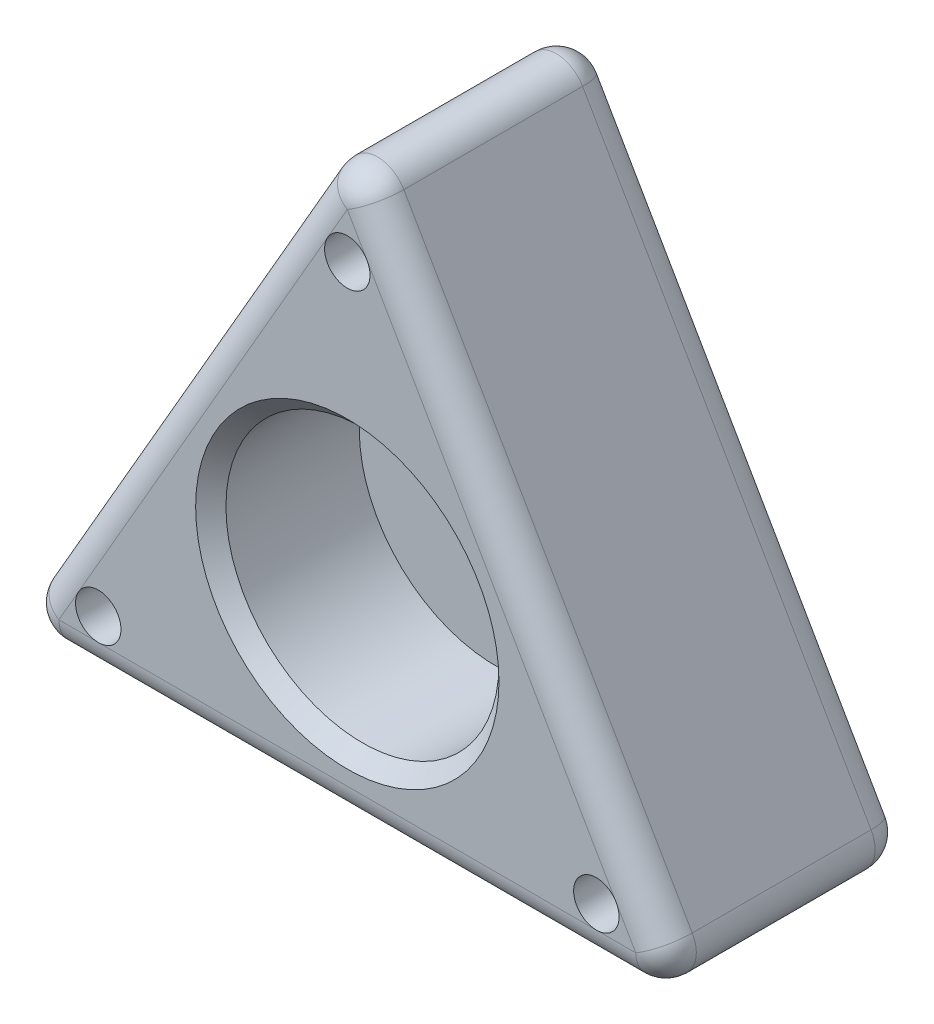
ISO-10303-21;
HEADER;
FILE_DESCRIPTION(('STEP AP214'),'2;1');
FILE_NAME('part.step','',(''),(''),'','','');
FILE_SCHEMA(('AUTOMOTIVE_DESIGN { 1 0 10303 214 1 1 1 1 }'));
ENDSEC;
DATA;
#1=APPLICATION_CONTEXT('core data for automotive mechanical design processes');
#2=APPLICATION_PROTOCOL_DEFINITION('international standard','automotive_design',2000,#1);
#3=PRODUCT_CONTEXT('',#1,'mechanical');
#4=PRODUCT('Part','Part','',(#3));
#5=PRODUCT_RELATED_PRODUCT_CATEGORY('part','',(#4));
#6=PRODUCT_DEFINITION_FORMATION('','',#4);
#7=PRODUCT_DEFINITION_CONTEXT('part definition',#1,'design');
#8=PRODUCT_DEFINITION('design','',#6,#7);
#9=PRODUCT_DEFINITION_SHAPE('','',#8);
#10=(LENGTH_UNIT() NAMED_UNIT(*) SI_UNIT(.MILLI.,.METRE.));
#11=(NAMED_UNIT(*) PLANE_ANGLE_UNIT() SI_UNIT($,.RADIAN.));
#12=(NAMED_UNIT(*) SI_UNIT($,.STERADIAN.) SOLID_ANGLE_UNIT());
#13=UNCERTAINTY_MEASURE_WITH_UNIT(LENGTH_MEASURE(1.E-05),#10,'distance_accuracy_value','');
#14=(GEOMETRIC_REPRESENTATION_CONTEXT(3) GLOBAL_UNCERTAINTY_ASSIGNED_CONTEXT((#13)) GLOBAL_UNIT_ASSIGNED_CONTEXT((#10,
#11,#12)) REPRESENTATION_CONTEXT('',''));
#15=CARTESIAN_POINT('',(0.,0.,0.));
#16=DIRECTION('',(0.,0.,1.));
#17=DIRECTION('',(1.,0.,0.));
#18=AXIS2_PLACEMENT_3D('',#15,#16,#17);
#19=CARTESIAN_POINT('',(22.4999999999999,34.9711431702998,-15.8));
#20=DIRECTION('',(0.,0.,1.));
#21=DIRECTION('',(-1.,0.,0.));
#22=AXIS2_PLACEMENT_3D('',#19,#20,#21);
#23=PLANE('',#22);
#24=DIRECTION('',(0.499999999999998,0.86602540378444,0.));
#25=VECTOR('',#24,1.);
#26=CARTESIAN_POINT('',(3.46410161513774,2.,-15.8));
#27=LINE('',#26,#25);
#28=CARTESIAN_POINT('',(4.76313972081451,4.2500000000002,-15.8));
#29=VERTEX_POINT('',#28);
#30=CARTESIAN_POINT('',(3.46410161513775,2.,-15.8));
#31=VERTEX_POINT('',#30);
#32=EDGE_CURVE('E232',#29,#31,#27,.F.);
#33=ORIENTED_EDGE('',*,*,#32,.F.);
#34=CARTESIAN_POINT('',(6.06217782649106,3.50000000000027,-15.8));
#35=DIRECTION('',(0.,0.,-1.));
#36=DIRECTION('',(-1.,0.,0.));
#37=AXIS2_PLACEMENT_3D('',#34,#35,#36);
#38=CIRCLE('',#37,1.5);
#39=CARTESIAN_POINT('',(6.06217782649106,2.,-15.8));
#40=VERTEX_POINT('',#39);
#41=EDGE_CURVE('E296',#40,#29,#38,.T.);
#42=ORIENTED_EDGE('',*,*,#41,.F.);
#43=DIRECTION('',(1.,0.,0.));
#44=VECTOR('',#43,1.);
#45=CARTESIAN_POINT('',(22.4999999999999,2.,-15.8));
#46=LINE('',#45,#44);
#47=EDGE_CURVE('E251',#31,#40,#46,.T.);
#48=ORIENTED_EDGE('',*,*,#47,.F.);
#49=EDGE_LOOP('',(#33,#42,#48));
#50=FACE_BOUND('',#49,.T.);
#51=ADVANCED_FACE('F37',(#50),#23,.F.);
#52=EDGE_CURVE('E292',#29,#40,#38,.T.);
#53=ORIENTED_EDGE('',*,*,#52,.F.);
#54=DIRECTION('',(0.499999999999998,0.86602540378444,0.));
#55=VECTOR('',#54,1.);
#56=CARTESIAN_POINT('',(3.46410161513774,2.,-15.8));
#57=LINE('',#56,#55);
#58=CARTESIAN_POINT('',(21.2009618943233,32.7211431702998,-15.8));
#59=VERTEX_POINT('',#58);
#60=EDGE_CURVE('E235',#59,#29,#57,.F.);
#61=ORIENTED_EDGE('',*,*,#60,.F.);
#62=CARTESIAN_POINT('',(22.4999999999999,31.9711431702998,-15.8));
#63=DIRECTION('',(0.,0.,1.));
#64=DIRECTION('',(1.,0.,0.));
#65=AXIS2_PLACEMENT_3D('',#62,#63,#64);
#66=CIRCLE('',#65,1.5);
#67=CARTESIAN_POINT('',(23.7990381056766,32.7211431702998,-15.8));
#68=VERTEX_POINT('',#67);
#69=EDGE_CURVE('E360',#59,#68,#66,.T.);
#70=ORIENTED_EDGE('',*,*,#69,.T.);
#71=DIRECTION('',(0.500000000000001,-0.866025403784438,0.));
#72=VECTOR('',#71,1.);
#73=CARTESIAN_POINT('',(22.4999999999999,34.9711431702998,-15.8));
#74=LINE('',#73,#72);
#75=CARTESIAN_POINT('',(40.2368602791856,4.25,-15.8));
#76=VERTEX_POINT('',#75);
#77=EDGE_CURVE('E242',#76,#68,#74,.F.);
#78=ORIENTED_EDGE('',*,*,#77,.F.);
#79=CARTESIAN_POINT('',(38.9378221735089,3.5,-15.8));
#80=DIRECTION('',(0.,0.,1.));
#81=DIRECTION('',(1.,0.,0.));
#82=AXIS2_PLACEMENT_3D('',#79,#80,#81);
#83=CIRCLE('',#82,1.5);
#84=CARTESIAN_POINT('',(38.9378221735089,2.,-15.8));
#85=VERTEX_POINT('',#84);
#86=EDGE_CURVE('E337',#76,#85,#83,.T.);
#87=ORIENTED_EDGE('',*,*,#86,.T.);
#88=DIRECTION('',(1.,0.,0.));
#89=VECTOR('',#88,1.);
#90=CARTESIAN_POINT('',(22.4999999999999,2.,-15.8));
#91=LINE('',#90,#89);
#92=EDGE_CURVE('E249',#40,#85,#91,.T.);
#93=ORIENTED_EDGE('',*,*,#92,.F.);
#94=EDGE_LOOP('',(#53,#61,#70,#78,#87,#93));
#95=FACE_BOUND('',#94,.T.);
#96=ADVANCED_FACE('F338',(#95),#23,.F.);
#97=EDGE_CURVE('E343',#85,#76,#83,.T.);
#98=ORIENTED_EDGE('',*,*,#97,.T.);
#99=DIRECTION('',(0.500000000000001,-0.866025403784438,0.));
#100=VECTOR('',#99,1.);
#101=CARTESIAN_POINT('',(22.4999999999999,34.9711431702998,-15.8));
#102=LINE('',#101,#100);
#103=CARTESIAN_POINT('',(41.5358983848622,2.,-15.8));
#104=VERTEX_POINT('',#103);
#105=EDGE_CURVE('E245',#104,#76,#102,.F.);
#106=ORIENTED_EDGE('',*,*,#105,.F.);
#107=DIRECTION('',(1.,0.,0.));
#108=VECTOR('',#107,1.);
#109=CARTESIAN_POINT('',(22.4999999999999,2.,-15.8));
#110=LINE('',#109,#108);
#111=EDGE_CURVE('E247',#85,#104,#110,.T.);
#112=ORIENTED_EDGE('',*,*,#111,.F.);
#113=EDGE_LOOP('',(#98,#106,#112));
#114=FACE_BOUND('',#113,.T.);
#115=ADVANCED_FACE('F404',(#114),#23,.F.);
#116=CARTESIAN_POINT('',(22.4999999999999,34.9711431702998,0.));
#117=DIRECTION('',(0.,0.,1.));
#118=DIRECTION('',(-1.,0.,0.));
#119=AXIS2_PLACEMENT_3D('',#116,#117,#118);
#120=PLANE('',#119);
#121=CARTESIAN_POINT('',(22.4999999999999,12.9903810567666,0.));
#122=DIRECTION('',(0.,0.,-1.));
#123=DIRECTION('',(-1.,0.,0.));
#124=AXIS2_PLACEMENT_3D('',#121,#122,#123);
#125=CIRCLE('',#124,10.01);
#126=CARTESIAN_POINT('',(12.4899999999999,12.9903810567666,0.));
#127=VERTEX_POINT('',#126);
#128=EDGE_CURVE('E182',#127,#127,#125,.F.);
#129=ORIENTED_EDGE('',*,*,#128,.F.);
#130=EDGE_LOOP('',(#129));
#131=FACE_BOUND('',#130,.T.);
#132=CARTESIAN_POINT('',(22.4999999999999,31.9711431702998,0.));
#133=DIRECTION('',(0.,0.,1.));
#134=DIRECTION('',(1.,0.,0.));
#135=AXIS2_PLACEMENT_3D('',#132,#133,#134);
#136=CIRCLE('',#135,1.5);
#137=CARTESIAN_POINT('',(21.2009618943233,32.7211431702998,0.));
#138=VERTEX_POINT('',#137);
#139=CARTESIAN_POINT('',(23.7990381056766,32.7211431702998,0.));
#140=VERTEX_POINT('',#139);
#141=EDGE_CURVE('E366',#138,#140,#136,.T.);
#142=ORIENTED_EDGE('',*,*,#141,.F.);
#143=DIRECTION('',(0.499999999999998,0.86602540378444,0.));
#144=VECTOR('',#143,1.);
#145=CARTESIAN_POINT('',(22.4999999999999,34.9711431702998,0.));
#146=LINE('',#145,#144);
#147=CARTESIAN_POINT('',(4.7631397208145,4.25000000000021,0.));
#148=VERTEX_POINT('',#147);
#149=EDGE_CURVE('E194',#148,#138,#146,.T.);
#150=ORIENTED_EDGE('',*,*,#149,.F.);
#151=CARTESIAN_POINT('',(6.06217782649106,3.50000000000027,0.));
#152=DIRECTION('',(0.,0.,-1.));
#153=DIRECTION('',(-1.,0.,0.));
#154=AXIS2_PLACEMENT_3D('',#151,#152,#153);
#155=CIRCLE('',#154,1.5);
#156=CARTESIAN_POINT('',(6.06217782649106,2.,0.));
#157=VERTEX_POINT('',#156);
#158=EDGE_CURVE('E307',#148,#157,#155,.T.);
#159=ORIENTED_EDGE('',*,*,#158,.T.);
#160=DIRECTION('',(1.,0.,0.));
#161=VECTOR('',#160,1.);
#162=CARTESIAN_POINT('',(3.46410161513775,2.,0.));
#163=LINE('',#162,#161);
#164=CARTESIAN_POINT('',(38.9378221735089,2.,0.));
#165=VERTEX_POINT('',#164);
#166=EDGE_CURVE('E204',#165,#157,#163,.F.);
#167=ORIENTED_EDGE('',*,*,#166,.F.);
#168=CARTESIAN_POINT('',(38.9378221735089,3.5,0.));
#169=DIRECTION('',(0.,0.,1.));
#170=DIRECTION('',(1.,0.,0.));
#171=AXIS2_PLACEMENT_3D('',#168,#169,#170);
#172=CIRCLE('',#171,1.5);
#173=CARTESIAN_POINT('',(40.2368602791856,4.25,0.));
#174=VERTEX_POINT('',#173);
#175=EDGE_CURVE('E346',#174,#165,#172,.T.);
#176=ORIENTED_EDGE('',*,*,#175,.F.);
#177=DIRECTION('',(0.500000000000001,-0.866025403784438,0.));
#178=VECTOR('',#177,1.);
#179=CARTESIAN_POINT('',(22.4999999999999,34.9711431702998,0.));
#180=LINE('',#179,#178);
#181=EDGE_CURVE('E212',#140,#174,#180,.T.);
#182=ORIENTED_EDGE('',*,*,#181,.F.);
#183=EDGE_LOOP('',(#142,#150,#159,#167,#176,#182));
#184=FACE_BOUND('',#183,.T.);
#185=ADVANCED_FACE('F382',(#131,#184),#120,.T.);
#186=EDGE_CURVE('E352',#165,#174,#172,.T.);
#187=ORIENTED_EDGE('',*,*,#186,.F.);
#188=DIRECTION('',(1.,0.,0.));
#189=VECTOR('',#188,1.);
#190=CARTESIAN_POINT('',(3.46410161513775,2.,0.));
#191=LINE('',#190,#189);
#192=CARTESIAN_POINT('',(41.5358983848622,2.,0.));
#193=VERTEX_POINT('',#192);
#194=EDGE_CURVE('E207',#193,#165,#191,.F.);
#195=ORIENTED_EDGE('',*,*,#194,.F.);
#196=DIRECTION('',(0.500000000000001,-0.866025403784438,0.));
#197=VECTOR('',#196,1.);
#198=CARTESIAN_POINT('',(22.4999999999999,34.9711431702998,0.));
#199=LINE('',#198,#197);
#200=EDGE_CURVE('E209',#174,#193,#199,.T.);
#201=ORIENTED_EDGE('',*,*,#200,.F.);
#202=EDGE_LOOP('',(#187,#195,#201));
#203=FACE_BOUND('',#202,.T.);
#204=ADVANCED_FACE('F413',(#203),#120,.T.);
#205=EDGE_CURVE('E342',#157,#148,#155,.T.);
#206=ORIENTED_EDGE('',*,*,#205,.T.);
#207=DIRECTION('',(0.499999999999998,0.86602540378444,0.));
#208=VECTOR('',#207,1.);
#209=CARTESIAN_POINT('',(22.4999999999999,34.9711431702998,0.));
#210=LINE('',#209,#208);
#211=CARTESIAN_POINT('',(3.46410161513773,2.00000000000001,0.));
#212=VERTEX_POINT('',#211);
#213=EDGE_CURVE('E197',#212,#148,#210,.T.);
#214=ORIENTED_EDGE('',*,*,#213,.F.);
#215=DIRECTION('',(1.,0.,0.));
#216=VECTOR('',#215,1.);
#217=CARTESIAN_POINT('',(3.46410161513775,2.,0.));
#218=LINE('',#217,#216);
#219=EDGE_CURVE('E201',#157,#212,#218,.F.);
#220=ORIENTED_EDGE('',*,*,#219,.F.);
#221=EDGE_LOOP('',(#206,#214,#220));
#222=FACE_BOUND('',#221,.T.);
#223=ADVANCED_FACE('F408',(#222),#120,.T.);
#224=EDGE_CURVE('E357',#68,#59,#66,.T.);
#225=ORIENTED_EDGE('',*,*,#224,.T.);
#226=DIRECTION('',(0.499999999999998,0.86602540378444,0.));
#227=VECTOR('',#226,1.);
#228=CARTESIAN_POINT('',(3.46410161513774,2.,-15.8));
#229=LINE('',#228,#227);
#230=CARTESIAN_POINT('',(22.4999999999999,34.9711431702998,-15.8));
#231=VERTEX_POINT('',#230);
#232=EDGE_CURVE('E237',#231,#59,#229,.F.);
#233=ORIENTED_EDGE('',*,*,#232,.F.);
#234=DIRECTION('',(0.500000000000001,-0.866025403784438,0.));
#235=VECTOR('',#234,1.);
#236=CARTESIAN_POINT('',(22.4999999999999,34.9711431702998,-15.8));
#237=LINE('',#236,#235);
#238=EDGE_CURVE('E239',#68,#231,#237,.F.);
#239=ORIENTED_EDGE('',*,*,#238,.F.);
#240=EDGE_LOOP('',(#225,#233,#239));
#241=FACE_BOUND('',#240,.T.);
#242=ADVANCED_FACE('F400',(#241),#23,.F.);
#243=DIRECTION('',(0.499999999999998,0.86602540378444,0.));
#244=VECTOR('',#243,1.);
#245=CARTESIAN_POINT('',(22.4999999999999,34.9711431702998,0.));
#246=LINE('',#245,#244);
#247=CARTESIAN_POINT('',(22.4999999999999,34.9711431702998,0.));
#248=VERTEX_POINT('',#247);
#249=EDGE_CURVE('E191',#138,#248,#246,.T.);
#250=ORIENTED_EDGE('',*,*,#249,.F.);
#251=EDGE_CURVE('E349',#140,#138,#136,.T.);
#252=ORIENTED_EDGE('',*,*,#251,.F.);
#253=DIRECTION('',(0.500000000000001,-0.866025403784438,0.));
#254=VECTOR('',#253,1.);
#255=CARTESIAN_POINT('',(22.4999999999999,34.9711431702998,0.));
#256=LINE('',#255,#254);
#257=EDGE_CURVE('E199',#248,#140,#256,.T.);
#258=ORIENTED_EDGE('',*,*,#257,.F.);
#259=EDGE_LOOP('',(#250,#252,#258));
#260=FACE_BOUND('',#259,.T.);
#261=ADVANCED_FACE('F378',(#260),#120,.T.);
#262=CARTESIAN_POINT('',(22.4999999999999,34.9711431702998,-15.8));
#263=DIRECTION('',(0.,0.,1.));
#264=DIRECTION('',(-1.,0.,0.));
#265=AXIS2_PLACEMENT_3D('',#262,#263,#264);
#266=CYLINDRICAL_SURFACE('',#265,1.99999999999999);
#267=DIRECTION('',(0.,0.,1.));
#268=VECTOR('',#267,1.);
#269=CARTESIAN_POINT('',(24.2320508075688,35.9711431702998,-15.8));
#270=LINE('',#269,#268);
#271=CARTESIAN_POINT('',(24.2320508075688,35.9711431702998,-13.8));
#272=VERTEX_POINT('',#271);
#273=CARTESIAN_POINT('',(24.2320508075688,35.9711431702998,-2.));
#274=VERTEX_POINT('',#273);
#275=EDGE_CURVE('E282',#272,#274,#270,.T.);
#276=ORIENTED_EDGE('',*,*,#275,.F.);
#277=CARTESIAN_POINT('',(22.4999999999999,34.9711431702998,-13.8));
#278=DIRECTION('',(0.,0.,-1.));
#279=DIRECTION('',(-1.,0.,0.));
#280=AXIS2_PLACEMENT_3D('',#277,#278,#279);
#281=CIRCLE('',#280,1.99999999999999);
#282=CARTESIAN_POINT('',(20.767949192431,35.9711431702998,-13.8));
#283=VERTEX_POINT('',#282);
#284=EDGE_CURVE('E226',#283,#272,#281,.T.);
#285=ORIENTED_EDGE('',*,*,#284,.F.);
#286=DIRECTION('',(0.,0.,1.));
#287=VECTOR('',#286,1.);
#288=CARTESIAN_POINT('',(20.767949192431,35.9711431702998,-15.8));
#289=LINE('',#288,#287);
#290=CARTESIAN_POINT('',(20.767949192431,35.9711431702998,-2.));
#291=VERTEX_POINT('',#290);
#292=EDGE_CURVE('E300',#283,#291,#289,.T.);
#293=ORIENTED_EDGE('',*,*,#292,.T.);
#294=CARTESIAN_POINT('',(22.4999999999999,34.9711431702998,-2.));
#295=DIRECTION('',(0.,0.,-1.));
#296=DIRECTION('',(-1.,0.,0.));
#297=AXIS2_PLACEMENT_3D('',#294,#295,#296);
#298=CIRCLE('',#297,1.99999999999999);
#299=EDGE_CURVE('E229',#274,#291,#298,.F.);
#300=ORIENTED_EDGE('',*,*,#299,.F.);
#301=EDGE_LOOP('',(#276,#285,#293,#300));
#302=FACE_BOUND('',#301,.T.);
#303=ADVANCED_FACE('F291',(#302),#266,.T.);
#304=CARTESIAN_POINT('',(1.73205080756887,3.,-15.8));
#305=DIRECTION('',(-0.86602540378444,0.499999999999998,0.));
#306=DIRECTION('',(-0.499999999999998,-0.86602540378444,0.));
#307=AXIS2_PLACEMENT_3D('',#304,#305,#306);
#308=PLANE('',#307);
#309=ORIENTED_EDGE('',*,*,#292,.F.);
#310=DIRECTION('',(0.499999999999998,0.86602540378444,0.));
#311=VECTOR('',#310,1.);
#312=CARTESIAN_POINT('',(20.767949192431,35.9711431702998,-13.8));
#313=LINE('',#312,#311);
#314=CARTESIAN_POINT('',(1.73205080756886,3.,-13.8));
#315=VERTEX_POINT('',#314);
#316=EDGE_CURVE('E46',#315,#283,#313,.T.);
#317=ORIENTED_EDGE('',*,*,#316,.F.);
#318=DIRECTION('',(0.,0.,1.));
#319=VECTOR('',#318,1.);
#320=CARTESIAN_POINT('',(1.73205080756886,3.,-15.8));
#321=LINE('',#320,#319);
#322=CARTESIAN_POINT('',(1.73205080756886,3.,-2.));
#323=VERTEX_POINT('',#322);
#324=EDGE_CURVE('E176',#315,#323,#321,.T.);
#325=ORIENTED_EDGE('',*,*,#324,.T.);
#326=DIRECTION('',(0.499999999999998,0.86602540378444,0.));
#327=VECTOR('',#326,1.);
#328=CARTESIAN_POINT('',(1.73205080756887,3.,-2.));
#329=LINE('',#328,#327);
#330=EDGE_CURVE('E11',#291,#323,#329,.F.);
#331=ORIENTED_EDGE('',*,*,#330,.F.);
#332=EDGE_LOOP('',(#309,#317,#325,#331));
#333=FACE_BOUND('',#332,.T.);
#334=ADVANCED_FACE('F324',(#333),#308,.T.);
#335=CARTESIAN_POINT('',(3.46410161513775,2.,-15.8));
#336=DIRECTION('',(0.,0.,1.));
#337=DIRECTION('',(-1.,0.,0.));
#338=AXIS2_PLACEMENT_3D('',#335,#336,#337);
#339=CYLINDRICAL_SURFACE('',#338,2.);
#340=ORIENTED_EDGE('',*,*,#324,.F.);
#341=CARTESIAN_POINT('',(3.46410161513775,2.,-13.8));
#342=DIRECTION('',(0.,0.,-1.));
#343=DIRECTION('',(-1.,0.,0.));
#344=AXIS2_PLACEMENT_3D('',#341,#342,#343);
#345=CIRCLE('',#344,2.);
#346=CARTESIAN_POINT('',(3.46410161513775,0.,-13.8));
#347=VERTEX_POINT('',#346);
#348=EDGE_CURVE('E150',#347,#315,#345,.T.);
#349=ORIENTED_EDGE('',*,*,#348,.F.);
#350=DIRECTION('',(0.,0.,1.));
#351=VECTOR('',#350,1.);
#352=CARTESIAN_POINT('',(3.46410161513775,0.,-15.8));
#353=LINE('',#352,#351);
#354=CARTESIAN_POINT('',(3.46410161513775,0.,-2.));
#355=VERTEX_POINT('',#354);
#356=EDGE_CURVE('E170',#347,#355,#353,.T.);
#357=ORIENTED_EDGE('',*,*,#356,.T.);
#358=CARTESIAN_POINT('',(3.46410161513775,2.,-2.));
#359=DIRECTION('',(0.,0.,-1.));
#360=DIRECTION('',(-1.,0.,0.));
#361=AXIS2_PLACEMENT_3D('',#358,#359,#360);
#362=CIRCLE('',#361,2.);
#363=EDGE_CURVE('E166',#323,#355,#362,.F.);
#364=ORIENTED_EDGE('',*,*,#363,.F.);
#365=EDGE_LOOP('',(#340,#349,#357,#364));
#366=FACE_BOUND('',#365,.T.);
#367=ADVANCED_FACE('F179',(#366),#339,.T.);
#368=CARTESIAN_POINT('',(3.46410161513775,0.,-15.8));
#369=DIRECTION('',(0.,1.,0.));
#370=DIRECTION('',(0.,0.,-1.));
#371=AXIS2_PLACEMENT_3D('',#368,#369,#370);
#372=PLANE('',#371);
#373=ORIENTED_EDGE('',*,*,#356,.F.);
#374=DIRECTION('',(1.,0.,0.));
#375=VECTOR('',#374,1.);
#376=CARTESIAN_POINT('',(3.46410161513775,0.,-13.8));
#377=LINE('',#376,#375);
#378=CARTESIAN_POINT('',(41.5358983848622,0.,-13.8));
#379=VERTEX_POINT('',#378);
#380=EDGE_CURVE('E158',#379,#347,#377,.F.);
#381=ORIENTED_EDGE('',*,*,#380,.F.);
#382=DIRECTION('',(0.,0.,1.));
#383=VECTOR('',#382,1.);
#384=CARTESIAN_POINT('',(41.5358983848622,0.,-15.8));
#385=LINE('',#384,#383);
#386=CARTESIAN_POINT('',(41.5358983848622,0.,-2.));
#387=VERTEX_POINT('',#386);
#388=EDGE_CURVE('E177',#379,#387,#385,.T.);
#389=ORIENTED_EDGE('',*,*,#388,.T.);
#390=DIRECTION('',(1.,0.,0.));
#391=VECTOR('',#390,1.);
#392=CARTESIAN_POINT('',(41.5358983848622,0.,-2.));
#393=LINE('',#392,#391);
#394=EDGE_CURVE('E165',#355,#387,#393,.T.);
#395=ORIENTED_EDGE('',*,*,#394,.F.);
#396=EDGE_LOOP('',(#373,#381,#389,#395));
#397=FACE_BOUND('',#396,.T.);
#398=ADVANCED_FACE('F171',(#397),#372,.F.);
#399=CARTESIAN_POINT('',(41.5358983848622,2.,-15.8));
#400=DIRECTION('',(0.,0.,1.));
#401=DIRECTION('',(-1.,0.,0.));
#402=AXIS2_PLACEMENT_3D('',#399,#400,#401);
#403=CYLINDRICAL_SURFACE('',#402,2.);
#404=ORIENTED_EDGE('',*,*,#388,.F.);
#405=CARTESIAN_POINT('',(41.5358983848622,2.,-13.8));
#406=DIRECTION('',(0.,0.,-1.));
#407=DIRECTION('',(-1.,0.,0.));
#408=AXIS2_PLACEMENT_3D('',#405,#406,#407);
#409=CIRCLE('',#408,2.);
#410=CARTESIAN_POINT('',(43.2679491924311,3.00000000000001,-13.8));
#411=VERTEX_POINT('',#410);
#412=EDGE_CURVE('E215',#411,#379,#409,.T.);
#413=ORIENTED_EDGE('',*,*,#412,.F.);
#414=DIRECTION('',(0.,0.,1.));
#415=VECTOR('',#414,1.);
#416=CARTESIAN_POINT('',(43.2679491924311,3.00000000000001,-15.8));
#417=LINE('',#416,#415);
#418=CARTESIAN_POINT('',(43.2679491924311,3.00000000000001,-2.));
#419=VERTEX_POINT('',#418);
#420=EDGE_CURVE('E284',#411,#419,#417,.T.);
#421=ORIENTED_EDGE('',*,*,#420,.T.);
#422=CARTESIAN_POINT('',(41.5358983848622,2.,-2.));
#423=DIRECTION('',(0.,0.,-1.));
#424=DIRECTION('',(-1.,0.,0.));
#425=AXIS2_PLACEMENT_3D('',#422,#423,#424);
#426=CIRCLE('',#425,2.);
#427=EDGE_CURVE('E217',#387,#419,#426,.F.);
#428=ORIENTED_EDGE('',*,*,#427,.F.);
#429=EDGE_LOOP('',(#404,#413,#421,#428));
#430=FACE_BOUND('',#429,.T.);
#431=ADVANCED_FACE('F311',(#430),#403,.T.);
#432=CARTESIAN_POINT('',(24.2320508075688,35.9711431702998,-15.8));
#433=DIRECTION('',(0.866025403784438,0.500000000000001,0.));
#434=DIRECTION('',(-0.500000000000001,0.866025403784438,0.));
#435=AXIS2_PLACEMENT_3D('',#432,#433,#434);
#436=PLANE('',#435);
#437=ORIENTED_EDGE('',*,*,#420,.F.);
#438=DIRECTION('',(0.500000000000001,-0.866025403784438,0.));
#439=VECTOR('',#438,1.);
#440=CARTESIAN_POINT('',(43.2679491924311,3.,-13.8));
#441=LINE('',#440,#439);
#442=EDGE_CURVE('E220',#272,#411,#441,.T.);
#443=ORIENTED_EDGE('',*,*,#442,.F.);
#444=ORIENTED_EDGE('',*,*,#275,.T.);
#445=DIRECTION('',(0.500000000000001,-0.866025403784438,0.));
#446=VECTOR('',#445,1.);
#447=CARTESIAN_POINT('',(24.2320508075688,35.9711431702998,-2.));
#448=LINE('',#447,#446);
#449=EDGE_CURVE('E223',#419,#274,#448,.F.);
#450=ORIENTED_EDGE('',*,*,#449,.F.);
#451=EDGE_LOOP('',(#437,#443,#444,#450));
#452=FACE_BOUND('',#451,.T.);
#453=ADVANCED_FACE('F279',(#452),#436,.T.);
#454=CARTESIAN_POINT('',(6.06217782649106,3.50000000000027,-15.8));
#455=DIRECTION('',(0.,0.,1.));
#456=DIRECTION('',(-1.,0.,0.));
#457=AXIS2_PLACEMENT_3D('',#454,#455,#456);
#458=CYLINDRICAL_SURFACE('',#457,1.5);
#459=ORIENTED_EDGE('',*,*,#52,.T.);
#460=ORIENTED_EDGE('',*,*,#41,.T.);
#461=EDGE_LOOP('',(#459,#460));
#462=FACE_BOUND('',#461,.T.);
#463=ORIENTED_EDGE('',*,*,#158,.F.);
#464=ORIENTED_EDGE('',*,*,#205,.F.);
#465=EDGE_LOOP('',(#463,#464));
#466=FACE_BOUND('',#465,.T.);
#467=ADVANCED_FACE('F423',(#462,#466),#458,.F.);
#468=CARTESIAN_POINT('',(38.9378221735089,3.5,-15.8));
#469=DIRECTION('',(0.,0.,1.));
#470=DIRECTION('',(-1.,0.,0.));
#471=AXIS2_PLACEMENT_3D('',#468,#469,#470);
#472=CYLINDRICAL_SURFACE('',#471,1.5);
#473=ORIENTED_EDGE('',*,*,#86,.F.);
#474=ORIENTED_EDGE('',*,*,#97,.F.);
#475=EDGE_LOOP('',(#473,#474));
#476=FACE_BOUND('',#475,.T.);
#477=ORIENTED_EDGE('',*,*,#175,.T.);
#478=ORIENTED_EDGE('',*,*,#186,.T.);
#479=EDGE_LOOP('',(#477,#478));
#480=FACE_BOUND('',#479,.T.);
#481=ADVANCED_FACE('F421',(#476,#480),#472,.F.);
#482=CARTESIAN_POINT('',(22.4999999999999,31.9711431702998,-15.8));
#483=DIRECTION('',(0.,0.,1.));
#484=DIRECTION('',(-1.,0.,0.));
#485=AXIS2_PLACEMENT_3D('',#482,#483,#484);
#486=CYLINDRICAL_SURFACE('',#485,1.5);
#487=ORIENTED_EDGE('',*,*,#224,.F.);
#488=ORIENTED_EDGE('',*,*,#69,.F.);
#489=EDGE_LOOP('',(#487,#488));
#490=FACE_BOUND('',#489,.T.);
#491=ORIENTED_EDGE('',*,*,#251,.T.);
#492=ORIENTED_EDGE('',*,*,#141,.T.);
#493=EDGE_LOOP('',(#491,#492));
#494=FACE_BOUND('',#493,.T.);
#495=ADVANCED_FACE('F374',(#490,#494),#486,.F.);
#496=CARTESIAN_POINT('',(22.4999999999999,12.9903810567666,-9.8));
#497=DIRECTION('',(0.,0.,1.));
#498=DIRECTION('',(-1.,0.,0.));
#499=AXIS2_PLACEMENT_3D('',#496,#497,#498);
#500=CYLINDRICAL_SURFACE('',#499,9.01);
#501=CARTESIAN_POINT('',(22.4999999999999,12.9903810567666,-1.00000000000002));
#502=DIRECTION('',(0.,0.,-1.));
#503=DIRECTION('',(-1.,0.,0.));
#504=AXIS2_PLACEMENT_3D('',#501,#502,#503);
#505=CIRCLE('',#504,9.01);
#506=CARTESIAN_POINT('',(13.4899999999999,12.9903810567666,-1.00000000000002));
#507=VERTEX_POINT('',#506);
#508=EDGE_CURVE('E186',#507,#507,#505,.T.);
#509=ORIENTED_EDGE('',*,*,#508,.F.);
#510=EDGE_LOOP('',(#509));
#511=FACE_BOUND('',#510,.T.);
#512=CARTESIAN_POINT('',(22.4999999999999,12.9903810567666,-9.8));
#513=DIRECTION('',(0.,0.,-1.));
#514=DIRECTION('',(-1.,0.,0.));
#515=AXIS2_PLACEMENT_3D('',#512,#513,#514);
#516=CIRCLE('',#515,9.01);
#517=CARTESIAN_POINT('',(13.4899999999999,12.9903810567666,-9.8));
#518=VERTEX_POINT('',#517);
#519=EDGE_CURVE('E267',#518,#518,#516,.T.);
#520=ORIENTED_EDGE('',*,*,#519,.T.);
#521=EDGE_LOOP('',(#520));
#522=FACE_BOUND('',#521,.T.);
#523=ADVANCED_FACE('F429',(#511,#522),#500,.F.);
#524=CARTESIAN_POINT('',(22.4999999999999,12.9903810567666,-9.8));
#525=DIRECTION('',(0.,0.,1.));
#526=DIRECTION('',(-1.,0.,0.));
#527=AXIS2_PLACEMENT_3D('',#524,#525,#526);
#528=PLANE('',#527);
#529=ORIENTED_EDGE('',*,*,#519,.F.);
#530=EDGE_LOOP('',(#529));
#531=FACE_BOUND('',#530,.T.);
#532=ADVANCED_FACE('F436',(#531),#528,.T.);
#533=CARTESIAN_POINT('',(22.4999999999999,12.9903810567666,-1.00000000000002));
#534=DIRECTION('',(0.,0.,1.));
#535=DIRECTION('',(-1.,0.,0.));
#536=AXIS2_PLACEMENT_3D('',#533,#534,#535);
#537=CONICAL_SURFACE('',#536,9.01,0.785398163397447);
#538=ORIENTED_EDGE('',*,*,#128,.T.);
#539=EDGE_LOOP('',(#538));
#540=FACE_BOUND('',#539,.T.);
#541=ORIENTED_EDGE('',*,*,#508,.T.);
#542=EDGE_LOOP('',(#541));
#543=FACE_BOUND('',#542,.T.);
#544=ADVANCED_FACE('F396',(#540,#543),#537,.F.);
#545=CARTESIAN_POINT('',(22.4999999999999,34.9711431702998,-2.));
#546=DIRECTION('',(0.500000000000001,-0.866025403784438,0.));
#547=DIRECTION('',(0.866025403784438,0.500000000000001,0.));
#548=AXIS2_PLACEMENT_3D('',#545,#546,#547);
#549=CYLINDRICAL_SURFACE('',#548,2.);
#550=CARTESIAN_POINT('',(22.4999999999999,34.9711431702998,-2.));
#551=DIRECTION('',(0.500000000000001,-0.866025403784438,0.));
#552=DIRECTION('',(-0.866025403784438,-0.500000000000001,0.));
#553=AXIS2_PLACEMENT_3D('',#550,#551,#552);
#554=CIRCLE('',#553,2.);
#555=EDGE_CURVE('E265',#274,#248,#554,.T.);
#556=ORIENTED_EDGE('',*,*,#555,.T.);
#557=ORIENTED_EDGE('',*,*,#257,.T.);
#558=ORIENTED_EDGE('',*,*,#181,.T.);
#559=ORIENTED_EDGE('',*,*,#200,.T.);
#560=CARTESIAN_POINT('',(41.5358983848622,2.,-2.));
#561=DIRECTION('',(-0.500000000000002,0.866025403784437,0.));
#562=DIRECTION('',(0.866025403784437,0.500000000000002,0.));
#563=AXIS2_PLACEMENT_3D('',#560,#561,#562);
#564=CIRCLE('',#563,2.);
#565=EDGE_CURVE('E263',#193,#419,#564,.T.);
#566=ORIENTED_EDGE('',*,*,#565,.T.);
#567=ORIENTED_EDGE('',*,*,#449,.T.);
#568=EDGE_LOOP('',(#556,#557,#558,#559,#566,#567));
#569=FACE_BOUND('',#568,.T.);
#570=ADVANCED_FACE('F384',(#569),#549,.T.);
#571=CARTESIAN_POINT('',(22.4999999999999,34.9711431702998,-2.));
#572=DIRECTION('',(0.,0.,1.));
#573=DIRECTION('',(-1.,0.,0.));
#574=AXIS2_PLACEMENT_3D('',#571,#572,#573);
#575=SPHERICAL_SURFACE('',#574,2.);
#576=ORIENTED_EDGE('',*,*,#299,.T.);
#577=CARTESIAN_POINT('',(22.4999999999999,34.9711431702998,-2.));
#578=DIRECTION('',(0.499999999999997,0.86602540378444,0.));
#579=DIRECTION('',(0.866025403784441,-0.499999999999997,0.));
#580=AXIS2_PLACEMENT_3D('',#577,#578,#579);
#581=CIRCLE('',#580,2.);
#582=EDGE_CURVE('E261',#291,#248,#581,.T.);
#583=ORIENTED_EDGE('',*,*,#582,.T.);
#584=ORIENTED_EDGE('',*,*,#555,.F.);
#585=EDGE_LOOP('',(#576,#583,#584));
#586=FACE_BOUND('',#585,.T.);
#587=ADVANCED_FACE('F387',(#586),#575,.T.);
#588=CARTESIAN_POINT('',(41.5358983848622,2.,-2.));
#589=DIRECTION('',(0.,0.,1.));
#590=DIRECTION('',(-1.,0.,0.));
#591=AXIS2_PLACEMENT_3D('',#588,#589,#590);
#592=SPHERICAL_SURFACE('',#591,2.);
#593=ORIENTED_EDGE('',*,*,#565,.F.);
#594=CARTESIAN_POINT('',(41.5358983848622,2.,-2.));
#595=DIRECTION('',(1.,0.,0.));
#596=DIRECTION('',(0.,-1.,0.));
#597=AXIS2_PLACEMENT_3D('',#594,#595,#596);
#598=CIRCLE('',#597,2.);
#599=EDGE_CURVE('E259',#193,#387,#598,.T.);
#600=ORIENTED_EDGE('',*,*,#599,.T.);
#601=ORIENTED_EDGE('',*,*,#427,.T.);
#602=EDGE_LOOP('',(#593,#600,#601));
#603=FACE_BOUND('',#602,.T.);
#604=ADVANCED_FACE('F389',(#603),#592,.T.);
#605=CARTESIAN_POINT('',(22.4999999999999,34.9711431702998,-2.));
#606=DIRECTION('',(0.499999999999998,0.86602540378444,0.));
#607=DIRECTION('',(-0.86602540378444,0.499999999999998,0.));
#608=AXIS2_PLACEMENT_3D('',#605,#606,#607);
#609=CYLINDRICAL_SURFACE('',#608,2.);
#610=ORIENTED_EDGE('',*,*,#149,.T.);
#611=ORIENTED_EDGE('',*,*,#249,.T.);
#612=ORIENTED_EDGE('',*,*,#582,.F.);
#613=ORIENTED_EDGE('',*,*,#330,.T.);
#614=CARTESIAN_POINT('',(3.46410161513774,2.,-2.));
#615=DIRECTION('',(0.499999999999998,0.86602540378444,0.));
#616=DIRECTION('',(0.86602540378444,-0.499999999999998,0.));
#617=AXIS2_PLACEMENT_3D('',#614,#615,#616);
#618=CIRCLE('',#617,2.);
#619=EDGE_CURVE('E256',#323,#212,#618,.T.);
#620=ORIENTED_EDGE('',*,*,#619,.T.);
#621=ORIENTED_EDGE('',*,*,#213,.T.);
#622=EDGE_LOOP('',(#610,#611,#612,#613,#620,#621));
#623=FACE_BOUND('',#622,.T.);
#624=ADVANCED_FACE('F320',(#623),#609,.T.);
#625=CARTESIAN_POINT('',(3.46410161513775,2.,-2.));
#626=DIRECTION('',(-1.,0.,0.));
#627=DIRECTION('',(0.,0.,-1.));
#628=AXIS2_PLACEMENT_3D('',#625,#626,#627);
#629=CYLINDRICAL_SURFACE('',#628,2.);
#630=ORIENTED_EDGE('',*,*,#599,.F.);
#631=ORIENTED_EDGE('',*,*,#194,.T.);
#632=ORIENTED_EDGE('',*,*,#166,.T.);
#633=ORIENTED_EDGE('',*,*,#219,.T.);
#634=CARTESIAN_POINT('',(3.46410161513775,2.,-2.));
#635=DIRECTION('',(1.,0.,0.));
#636=DIRECTION('',(0.,0.,-1.));
#637=AXIS2_PLACEMENT_3D('',#634,#635,#636);
#638=CIRCLE('',#637,2.);
#639=EDGE_CURVE('E254',#212,#355,#638,.T.);
#640=ORIENTED_EDGE('',*,*,#639,.T.);
#641=ORIENTED_EDGE('',*,*,#394,.T.);
#642=EDGE_LOOP('',(#630,#631,#632,#633,#640,#641));
#643=FACE_BOUND('',#642,.T.);
#644=ADVANCED_FACE('F315',(#643),#629,.T.);
#645=CARTESIAN_POINT('',(3.46410161513775,2.,-2.));
#646=DIRECTION('',(0.,0.,1.));
#647=DIRECTION('',(-1.,0.,0.));
#648=AXIS2_PLACEMENT_3D('',#645,#646,#647);
#649=SPHERICAL_SURFACE('',#648,2.);
#650=ORIENTED_EDGE('',*,*,#363,.T.);
#651=ORIENTED_EDGE('',*,*,#639,.F.);
#652=ORIENTED_EDGE('',*,*,#619,.F.);
#653=EDGE_LOOP('',(#650,#651,#652));
#654=FACE_BOUND('',#653,.T.);
#655=ADVANCED_FACE('F318',(#654),#649,.T.);
#656=CARTESIAN_POINT('',(22.4999999999999,34.9711431702998,-13.8));
#657=DIRECTION('',(-0.500000000000001,0.866025403784438,0.));
#658=DIRECTION('',(-0.866025403784438,-0.500000000000001,0.));
#659=AXIS2_PLACEMENT_3D('',#656,#657,#658);
#660=CYLINDRICAL_SURFACE('',#659,2.);
#661=CARTESIAN_POINT('',(41.5358983848622,2.,-13.8));
#662=DIRECTION('',(-0.500000000000001,0.866025403784438,0.));
#663=DIRECTION('',(0.866025403784438,0.500000000000001,0.));
#664=AXIS2_PLACEMENT_3D('',#661,#662,#663);
#665=CIRCLE('',#664,2.);
#666=EDGE_CURVE('E271',#411,#104,#665,.T.);
#667=ORIENTED_EDGE('',*,*,#666,.T.);
#668=ORIENTED_EDGE('',*,*,#105,.T.);
#669=ORIENTED_EDGE('',*,*,#77,.T.);
#670=ORIENTED_EDGE('',*,*,#238,.T.);
#671=CARTESIAN_POINT('',(22.4999999999999,34.9711431702998,-13.8));
#672=DIRECTION('',(0.500000000000001,-0.866025403784438,0.));
#673=DIRECTION('',(-0.866025403784438,-0.500000000000001,0.));
#674=AXIS2_PLACEMENT_3D('',#671,#672,#673);
#675=CIRCLE('',#674,2.);
#676=EDGE_CURVE('E41',#231,#272,#675,.T.);
#677=ORIENTED_EDGE('',*,*,#676,.T.);
#678=ORIENTED_EDGE('',*,*,#442,.T.);
#679=EDGE_LOOP('',(#667,#668,#669,#670,#677,#678));
#680=FACE_BOUND('',#679,.T.);
#681=ADVANCED_FACE('F39',(#680),#660,.T.);
#682=CARTESIAN_POINT('',(22.4999999999999,34.9711431702998,-13.8));
#683=DIRECTION('',(0.,0.,1.));
#684=DIRECTION('',(-1.,0.,0.));
#685=AXIS2_PLACEMENT_3D('',#682,#683,#684);
#686=SPHERICAL_SURFACE('',#685,2.);
#687=ORIENTED_EDGE('',*,*,#676,.F.);
#688=CARTESIAN_POINT('',(22.4999999999999,34.9711431702998,-13.8));
#689=DIRECTION('',(0.499999999999996,0.866025403784441,0.));
#690=DIRECTION('',(0.866025403784441,-0.499999999999996,0.));
#691=AXIS2_PLACEMENT_3D('',#688,#689,#690);
#692=CIRCLE('',#691,2.);
#693=EDGE_CURVE('E62',#231,#283,#692,.T.);
#694=ORIENTED_EDGE('',*,*,#693,.T.);
#695=ORIENTED_EDGE('',*,*,#284,.T.);
#696=EDGE_LOOP('',(#687,#694,#695));
#697=FACE_BOUND('',#696,.T.);
#698=ADVANCED_FACE('F287',(#697),#686,.T.);
#699=CARTESIAN_POINT('',(41.5358983848622,2.,-13.8));
#700=DIRECTION('',(0.,0.,1.));
#701=DIRECTION('',(-1.,0.,0.));
#702=AXIS2_PLACEMENT_3D('',#699,#700,#701);
#703=SPHERICAL_SURFACE('',#702,2.);
#704=ORIENTED_EDGE('',*,*,#412,.T.);
#705=CARTESIAN_POINT('',(41.5358983848622,2.,-13.8));
#706=DIRECTION('',(1.,0.,0.));
#707=DIRECTION('',(0.,-1.,0.));
#708=AXIS2_PLACEMENT_3D('',#705,#706,#707);
#709=CIRCLE('',#708,2.);
#710=EDGE_CURVE('E54',#379,#104,#709,.T.);
#711=ORIENTED_EDGE('',*,*,#710,.T.);
#712=ORIENTED_EDGE('',*,*,#666,.F.);
#713=EDGE_LOOP('',(#704,#711,#712));
#714=FACE_BOUND('',#713,.T.);
#715=ADVANCED_FACE('F478',(#714),#703,.T.);
#716=CARTESIAN_POINT('',(3.46410161513775,2.,-13.8));
#717=DIRECTION('',(-0.499999999999998,-0.86602540378444,0.));
#718=DIRECTION('',(0.86602540378444,-0.499999999999998,0.));
#719=AXIS2_PLACEMENT_3D('',#716,#717,#718);
#720=CYLINDRICAL_SURFACE('',#719,2.);
#721=ORIENTED_EDGE('',*,*,#693,.F.);
#722=ORIENTED_EDGE('',*,*,#232,.T.);
#723=ORIENTED_EDGE('',*,*,#60,.T.);
#724=ORIENTED_EDGE('',*,*,#32,.T.);
#725=CARTESIAN_POINT('',(3.46410161513775,2.,-13.8));
#726=DIRECTION('',(0.499999999999998,0.86602540378444,0.));
#727=DIRECTION('',(0.86602540378444,-0.499999999999998,0.));
#728=AXIS2_PLACEMENT_3D('',#725,#726,#727);
#729=CIRCLE('',#728,2.);
#730=EDGE_CURVE('E152',#31,#315,#729,.T.);
#731=ORIENTED_EDGE('',*,*,#730,.T.);
#732=ORIENTED_EDGE('',*,*,#316,.T.);
#733=EDGE_LOOP('',(#721,#722,#723,#724,#731,#732));
#734=FACE_BOUND('',#733,.T.);
#735=ADVANCED_FACE('F325',(#734),#720,.T.);
#736=CARTESIAN_POINT('',(22.4999999999999,2.,-13.8));
#737=DIRECTION('',(1.,0.,0.));
#738=DIRECTION('',(0.,0.,1.));
#739=AXIS2_PLACEMENT_3D('',#736,#737,#738);
#740=CYLINDRICAL_SURFACE('',#739,2.);
#741=ORIENTED_EDGE('',*,*,#92,.T.);
#742=ORIENTED_EDGE('',*,*,#111,.T.);
#743=ORIENTED_EDGE('',*,*,#710,.F.);
#744=ORIENTED_EDGE('',*,*,#380,.T.);
#745=CARTESIAN_POINT('',(3.46410161513775,2.,-13.8));
#746=DIRECTION('',(1.,0.,0.));
#747=DIRECTION('',(0.,0.,-1.));
#748=AXIS2_PLACEMENT_3D('',#745,#746,#747);
#749=CIRCLE('',#748,2.);
#750=EDGE_CURVE('E146',#347,#31,#749,.T.);
#751=ORIENTED_EDGE('',*,*,#750,.T.);
#752=ORIENTED_EDGE('',*,*,#47,.T.);
#753=EDGE_LOOP('',(#741,#742,#743,#744,#751,#752));
#754=FACE_BOUND('',#753,.T.);
#755=ADVANCED_FACE('F161',(#754),#740,.T.);
#756=CARTESIAN_POINT('',(3.46410161513775,2.,-13.8));
#757=DIRECTION('',(0.,0.,1.));
#758=DIRECTION('',(-1.,0.,0.));
#759=AXIS2_PLACEMENT_3D('',#756,#757,#758);
#760=SPHERICAL_SURFACE('',#759,2.);
#761=ORIENTED_EDGE('',*,*,#730,.F.);
#762=ORIENTED_EDGE('',*,*,#750,.F.);
#763=ORIENTED_EDGE('',*,*,#348,.T.);
#764=EDGE_LOOP('',(#761,#762,#763));
#765=FACE_BOUND('',#764,.T.);
#766=ADVANCED_FACE('F148',(#765),#760,.T.);
#767=CLOSED_SHELL('',(#51,#96,#115,#185,#204,#223,#242,#261,#303,#334,#367,#398,#431,#453,#467,
#481,#495,#523,#532,#544,#570,#587,#604,#624,#644,#655,#681,#698,#715,#735,#755,#766));
#768=MANIFOLD_SOLID_BREP('B2',#767);
#769=ADVANCED_BREP_SHAPE_REPRESENTATION('',(#18,#768),#14);
#770=SHAPE_DEFINITION_REPRESENTATION(#9,#769);
ENDSEC;
END-ISO-10303-21;
